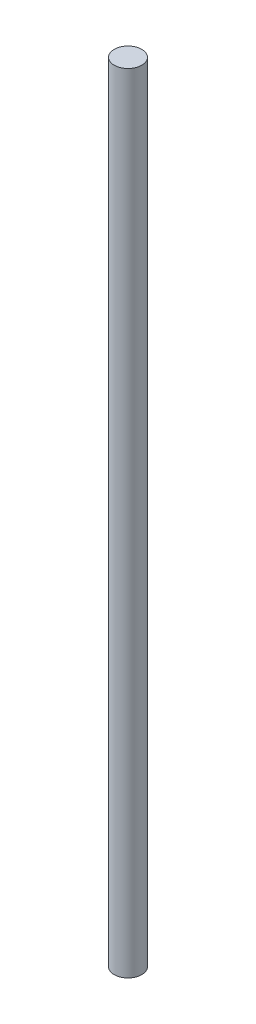
ISO-10303-21;
HEADER;
FILE_DESCRIPTION(('STEP AP214'),'2;1');
FILE_NAME('part.step','',(''),(''),'','','');
FILE_SCHEMA(('AUTOMOTIVE_DESIGN { 1 0 10303 214 1 1 1 1 }'));
ENDSEC;
DATA;
#1=APPLICATION_CONTEXT('core data for automotive mechanical design processes');
#2=APPLICATION_PROTOCOL_DEFINITION('international standard','automotive_design',2000,#1);
#3=PRODUCT_CONTEXT('',#1,'mechanical');
#4=PRODUCT('Part','Part','',(#3));
#5=PRODUCT_RELATED_PRODUCT_CATEGORY('part','',(#4));
#6=PRODUCT_DEFINITION_FORMATION('','',#4);
#7=PRODUCT_DEFINITION_CONTEXT('part definition',#1,'design');
#8=PRODUCT_DEFINITION('design','',#6,#7);
#9=PRODUCT_DEFINITION_SHAPE('','',#8);
#10=(LENGTH_UNIT() NAMED_UNIT(*) SI_UNIT(.MILLI.,.METRE.));
#11=(NAMED_UNIT(*) PLANE_ANGLE_UNIT() SI_UNIT($,.RADIAN.));
#12=(NAMED_UNIT(*) SI_UNIT($,.STERADIAN.) SOLID_ANGLE_UNIT());
#13=UNCERTAINTY_MEASURE_WITH_UNIT(LENGTH_MEASURE(1.E-05),#10,'distance_accuracy_value','');
#14=(GEOMETRIC_REPRESENTATION_CONTEXT(3) GLOBAL_UNCERTAINTY_ASSIGNED_CONTEXT((#13)) GLOBAL_UNIT_ASSIGNED_CONTEXT((#10,
#11,#12)) REPRESENTATION_CONTEXT('',''));
#15=CARTESIAN_POINT('',(0.,0.,0.));
#16=DIRECTION('',(0.,0.,1.));
#17=DIRECTION('',(1.,0.,0.));
#18=AXIS2_PLACEMENT_3D('',#15,#16,#17);
#19=CARTESIAN_POINT('',(0.,200.,0.));
#20=DIRECTION('',(0.,-1.,0.));
#21=DIRECTION('',(0.,0.,-1.));
#22=AXIS2_PLACEMENT_3D('',#19,#20,#21);
#23=CYLINDRICAL_SURFACE('',#22,3.5);
#24=CARTESIAN_POINT('',(0.,200.,0.));
#25=DIRECTION('',(0.,1.,0.));
#26=DIRECTION('',(0.,0.,1.));
#27=AXIS2_PLACEMENT_3D('',#24,#25,#26);
#28=CIRCLE('',#27,3.5);
#29=CARTESIAN_POINT('',(0.,200.,3.5));
#30=VERTEX_POINT('',#29);
#31=EDGE_CURVE('E10',#30,#30,#28,.T.);
#32=ORIENTED_EDGE('',*,*,#31,.F.);
#33=EDGE_LOOP('',(#32));
#34=FACE_BOUND('',#33,.T.);
#35=CARTESIAN_POINT('',(0.,0.,0.));
#36=DIRECTION('',(0.,1.,0.));
#37=DIRECTION('',(0.,0.,1.));
#38=AXIS2_PLACEMENT_3D('',#35,#36,#37);
#39=CIRCLE('',#38,3.5);
#40=CARTESIAN_POINT('',(0.,0.,3.5));
#41=VERTEX_POINT('',#40);
#42=EDGE_CURVE('E33',#41,#41,#39,.T.);
#43=ORIENTED_EDGE('',*,*,#42,.T.);
#44=EDGE_LOOP('',(#43));
#45=FACE_BOUND('',#44,.T.);
#46=ADVANCED_FACE('F30',(#34,#45),#23,.T.);
#47=CARTESIAN_POINT('',(0.,200.,0.));
#48=DIRECTION('',(0.,1.,0.));
#49=DIRECTION('',(0.,0.,1.));
#50=AXIS2_PLACEMENT_3D('',#47,#48,#49);
#51=PLANE('',#50);
#52=ORIENTED_EDGE('',*,*,#31,.T.);
#53=EDGE_LOOP('',(#52));
#54=FACE_BOUND('',#53,.T.);
#55=ADVANCED_FACE('F45',(#54),#51,.T.);
#56=CARTESIAN_POINT('',(0.,0.,0.));
#57=DIRECTION('',(0.,1.,0.));
#58=DIRECTION('',(0.,0.,1.));
#59=AXIS2_PLACEMENT_3D('',#56,#57,#58);
#60=PLANE('',#59);
#61=ORIENTED_EDGE('',*,*,#42,.F.);
#62=EDGE_LOOP('',(#61));
#63=FACE_BOUND('',#62,.T.);
#64=ADVANCED_FACE('F43',(#63),#60,.F.);
#65=CLOSED_SHELL('',(#46,#55,#64));
#66=MANIFOLD_SOLID_BREP('B2',#65);
#67=ADVANCED_BREP_SHAPE_REPRESENTATION('',(#18,#66),#14);
#68=SHAPE_DEFINITION_REPRESENTATION(#9,#67);
ENDSEC;
END-ISO-10303-21;
